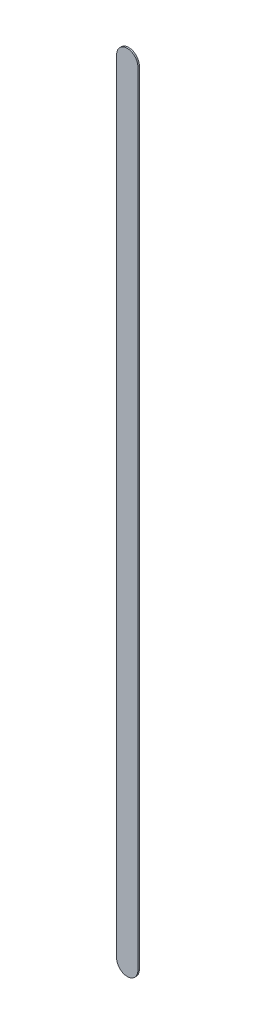
ISO-10303-21;
HEADER;
FILE_DESCRIPTION(('STEP AP214'),'2;1');
FILE_NAME('part.step','',(''),(''),'','','');
FILE_SCHEMA(('AUTOMOTIVE_DESIGN { 1 0 10303 214 1 1 1 1 }'));
ENDSEC;
DATA;
#1=APPLICATION_CONTEXT('core data for automotive mechanical design processes');
#2=APPLICATION_PROTOCOL_DEFINITION('international standard','automotive_design',2000,#1);
#3=PRODUCT_CONTEXT('',#1,'mechanical');
#4=PRODUCT('Part','Part','',(#3));
#5=PRODUCT_RELATED_PRODUCT_CATEGORY('part','',(#4));
#6=PRODUCT_DEFINITION_FORMATION('','',#4);
#7=PRODUCT_DEFINITION_CONTEXT('part definition',#1,'design');
#8=PRODUCT_DEFINITION('design','',#6,#7);
#9=PRODUCT_DEFINITION_SHAPE('','',#8);
#10=(LENGTH_UNIT() NAMED_UNIT(*) SI_UNIT(.MILLI.,.METRE.));
#11=(NAMED_UNIT(*) PLANE_ANGLE_UNIT() SI_UNIT($,.RADIAN.));
#12=(NAMED_UNIT(*) SI_UNIT($,.STERADIAN.) SOLID_ANGLE_UNIT());
#13=UNCERTAINTY_MEASURE_WITH_UNIT(LENGTH_MEASURE(1.E-05),#10,'distance_accuracy_value','');
#14=(GEOMETRIC_REPRESENTATION_CONTEXT(3) GLOBAL_UNCERTAINTY_ASSIGNED_CONTEXT((#13)) GLOBAL_UNIT_ASSIGNED_CONTEXT((#10,
#11,#12)) REPRESENTATION_CONTEXT('',''));
#15=CARTESIAN_POINT('',(0.,0.,0.));
#16=DIRECTION('',(0.,0.,1.));
#17=DIRECTION('',(1.,0.,0.));
#18=AXIS2_PLACEMENT_3D('',#15,#16,#17);
#19=CARTESIAN_POINT('',(101.14999836,77.50000502,0.));
#20=DIRECTION('',(-1.,0.,0.));
#21=DIRECTION('',(0.,1.,0.));
#22=AXIS2_PLACEMENT_3D('',#19,#20,#21);
#23=PLANE('',#22);
#24=DIRECTION('',(0.,1.,0.));
#25=VECTOR('',#24,1.);
#26=CARTESIAN_POINT('',(101.14999836,77.50000502,0.03556));
#27=LINE('',#26,#25);
#28=CARTESIAN_POINT('',(101.14999836,77.50000502,0.03556));
#29=VERTEX_POINT('',#28);
#30=CARTESIAN_POINT('',(101.14999836,96.00000104,0.03556));
#31=VERTEX_POINT('',#30);
#32=EDGE_CURVE('E11',#29,#31,#27,.T.);
#33=ORIENTED_EDGE('',*,*,#32,.F.);
#34=DIRECTION('',(0.,0.,1.));
#35=VECTOR('',#34,1.);
#36=CARTESIAN_POINT('',(101.14999836,77.50000502,0.));
#37=LINE('',#36,#35);
#38=CARTESIAN_POINT('',(101.14999836,77.50000502,0.));
#39=VERTEX_POINT('',#38);
#40=EDGE_CURVE('E24',#39,#29,#37,.T.);
#41=ORIENTED_EDGE('',*,*,#40,.F.);
#42=DIRECTION('',(0.,1.,0.));
#43=VECTOR('',#42,1.);
#44=CARTESIAN_POINT('',(101.14999836,77.50000502,0.));
#45=LINE('',#44,#43);
#46=CARTESIAN_POINT('',(101.14999836,96.00000104,0.));
#47=VERTEX_POINT('',#46);
#48=EDGE_CURVE('E75',#39,#47,#45,.T.);
#49=ORIENTED_EDGE('',*,*,#48,.T.);
#50=DIRECTION('',(0.,0.,1.));
#51=VECTOR('',#50,1.);
#52=CARTESIAN_POINT('',(101.14999836,96.00000104,0.));
#53=LINE('',#52,#51);
#54=EDGE_CURVE('E37',#47,#31,#53,.T.);
#55=ORIENTED_EDGE('',*,*,#54,.T.);
#56=EDGE_LOOP('',(#33,#41,#49,#55));
#57=FACE_BOUND('',#56,.T.);
#58=ADVANCED_FACE('F17',(#57),#23,.F.);
#59=CARTESIAN_POINT('',(100.89999886,96.00000104,0.));
#60=DIRECTION('',(0.,0.,-1.));
#61=DIRECTION('',(1.,0.,0.));
#62=AXIS2_PLACEMENT_3D('',#59,#60,#61);
#63=CYLINDRICAL_SURFACE('',#62,0.249999500000001);
#64=CARTESIAN_POINT('',(100.89999886,96.00000104,0.03556));
#65=DIRECTION('',(0.,0.,1.));
#66=DIRECTION('',(1.,0.,0.));
#67=AXIS2_PLACEMENT_3D('',#64,#65,#66);
#68=CIRCLE('',#67,0.249999500000001);
#69=CARTESIAN_POINT('',(100.64999936,96.00000104,0.03556));
#70=VERTEX_POINT('',#69);
#71=EDGE_CURVE('E83',#31,#70,#68,.T.);
#72=ORIENTED_EDGE('',*,*,#71,.F.);
#73=ORIENTED_EDGE('',*,*,#54,.F.);
#74=CARTESIAN_POINT('',(100.89999886,96.00000104,0.));
#75=DIRECTION('',(0.,0.,1.));
#76=DIRECTION('',(1.,0.,0.));
#77=AXIS2_PLACEMENT_3D('',#74,#75,#76);
#78=CIRCLE('',#77,0.249999500000001);
#79=CARTESIAN_POINT('',(100.64999936,96.00000104,0.));
#80=VERTEX_POINT('',#79);
#81=EDGE_CURVE('E81',#47,#80,#78,.T.);
#82=ORIENTED_EDGE('',*,*,#81,.T.);
#83=DIRECTION('',(0.,0.,1.));
#84=VECTOR('',#83,1.);
#85=CARTESIAN_POINT('',(100.64999936,96.00000104,0.));
#86=LINE('',#85,#84);
#87=EDGE_CURVE('E67',#80,#70,#86,.T.);
#88=ORIENTED_EDGE('',*,*,#87,.T.);
#89=EDGE_LOOP('',(#72,#73,#82,#88));
#90=FACE_BOUND('',#89,.T.);
#91=ADVANCED_FACE('F89',(#90),#63,.T.);
#92=CARTESIAN_POINT('',(100.64999936,96.00000104,0.));
#93=DIRECTION('',(1.,0.,0.));
#94=DIRECTION('',(0.,-1.,0.));
#95=AXIS2_PLACEMENT_3D('',#92,#93,#94);
#96=PLANE('',#95);
#97=DIRECTION('',(0.,-1.,0.));
#98=VECTOR('',#97,1.);
#99=CARTESIAN_POINT('',(100.64999936,96.00000104,0.03556));
#100=LINE('',#99,#98);
#101=CARTESIAN_POINT('',(100.64999936,77.50000502,0.03556));
#102=VERTEX_POINT('',#101);
#103=EDGE_CURVE('E71',#70,#102,#100,.T.);
#104=ORIENTED_EDGE('',*,*,#103,.F.);
#105=ORIENTED_EDGE('',*,*,#87,.F.);
#106=DIRECTION('',(0.,-1.,0.));
#107=VECTOR('',#106,1.);
#108=CARTESIAN_POINT('',(100.64999936,96.00000104,0.));
#109=LINE('',#108,#107);
#110=CARTESIAN_POINT('',(100.64999936,77.50000502,0.));
#111=VERTEX_POINT('',#110);
#112=EDGE_CURVE('E63',#80,#111,#109,.T.);
#113=ORIENTED_EDGE('',*,*,#112,.T.);
#114=DIRECTION('',(0.,0.,1.));
#115=VECTOR('',#114,1.);
#116=CARTESIAN_POINT('',(100.64999936,77.50000502,0.));
#117=LINE('',#116,#115);
#118=EDGE_CURVE('E53',#111,#102,#117,.T.);
#119=ORIENTED_EDGE('',*,*,#118,.T.);
#120=EDGE_LOOP('',(#104,#105,#113,#119));
#121=FACE_BOUND('',#120,.T.);
#122=ADVANCED_FACE('F66',(#121),#96,.F.);
#123=CARTESIAN_POINT('',(100.89999886,77.50000502,0.));
#124=DIRECTION('',(0.,0.,-1.));
#125=DIRECTION('',(-1.,0.,0.));
#126=AXIS2_PLACEMENT_3D('',#123,#124,#125);
#127=CYLINDRICAL_SURFACE('',#126,0.249999500000001);
#128=CARTESIAN_POINT('',(100.89999886,77.50000502,0.03556));
#129=DIRECTION('',(0.,0.,1.));
#130=DIRECTION('',(-1.,0.,0.));
#131=AXIS2_PLACEMENT_3D('',#128,#129,#130);
#132=CIRCLE('',#131,0.249999500000001);
#133=EDGE_CURVE('E59',#102,#29,#132,.T.);
#134=ORIENTED_EDGE('',*,*,#133,.F.);
#135=ORIENTED_EDGE('',*,*,#118,.F.);
#136=CARTESIAN_POINT('',(100.89999886,77.50000502,0.));
#137=DIRECTION('',(0.,0.,1.));
#138=DIRECTION('',(-1.,0.,0.));
#139=AXIS2_PLACEMENT_3D('',#136,#137,#138);
#140=CIRCLE('',#139,0.249999500000001);
#141=EDGE_CURVE('E57',#111,#39,#140,.T.);
#142=ORIENTED_EDGE('',*,*,#141,.T.);
#143=ORIENTED_EDGE('',*,*,#40,.T.);
#144=EDGE_LOOP('',(#134,#135,#142,#143));
#145=FACE_BOUND('',#144,.T.);
#146=ADVANCED_FACE('F55',(#145),#127,.T.);
#147=CARTESIAN_POINT('',(101.14999836,77.50000502,0.));
#148=DIRECTION('',(0.,0.,-1.));
#149=DIRECTION('',(-1.,0.,0.));
#150=AXIS2_PLACEMENT_3D('',#147,#148,#149);
#151=PLANE('',#150);
#152=ORIENTED_EDGE('',*,*,#141,.F.);
#153=ORIENTED_EDGE('',*,*,#112,.F.);
#154=ORIENTED_EDGE('',*,*,#81,.F.);
#155=ORIENTED_EDGE('',*,*,#48,.F.);
#156=EDGE_LOOP('',(#152,#153,#154,#155));
#157=FACE_BOUND('',#156,.T.);
#158=ADVANCED_FACE('F74',(#157),#151,.T.);
#159=CARTESIAN_POINT('',(101.14999836,77.50000502,0.03556));
#160=DIRECTION('',(0.,0.,-1.));
#161=DIRECTION('',(-1.,0.,0.));
#162=AXIS2_PLACEMENT_3D('',#159,#160,#161);
#163=PLANE('',#162);
#164=ORIENTED_EDGE('',*,*,#32,.T.);
#165=ORIENTED_EDGE('',*,*,#71,.T.);
#166=ORIENTED_EDGE('',*,*,#103,.T.);
#167=ORIENTED_EDGE('',*,*,#133,.T.);
#168=EDGE_LOOP('',(#164,#165,#166,#167));
#169=FACE_BOUND('',#168,.T.);
#170=ADVANCED_FACE('F91',(#169),#163,.F.);
#171=CLOSED_SHELL('',(#58,#91,#122,#146,#158,#170));
#172=MANIFOLD_SOLID_BREP('B1',#171);
#173=ADVANCED_BREP_SHAPE_REPRESENTATION('',(#18,#172),#14);
#174=SHAPE_DEFINITION_REPRESENTATION(#9,#173);
ENDSEC;
END-ISO-10303-21;
